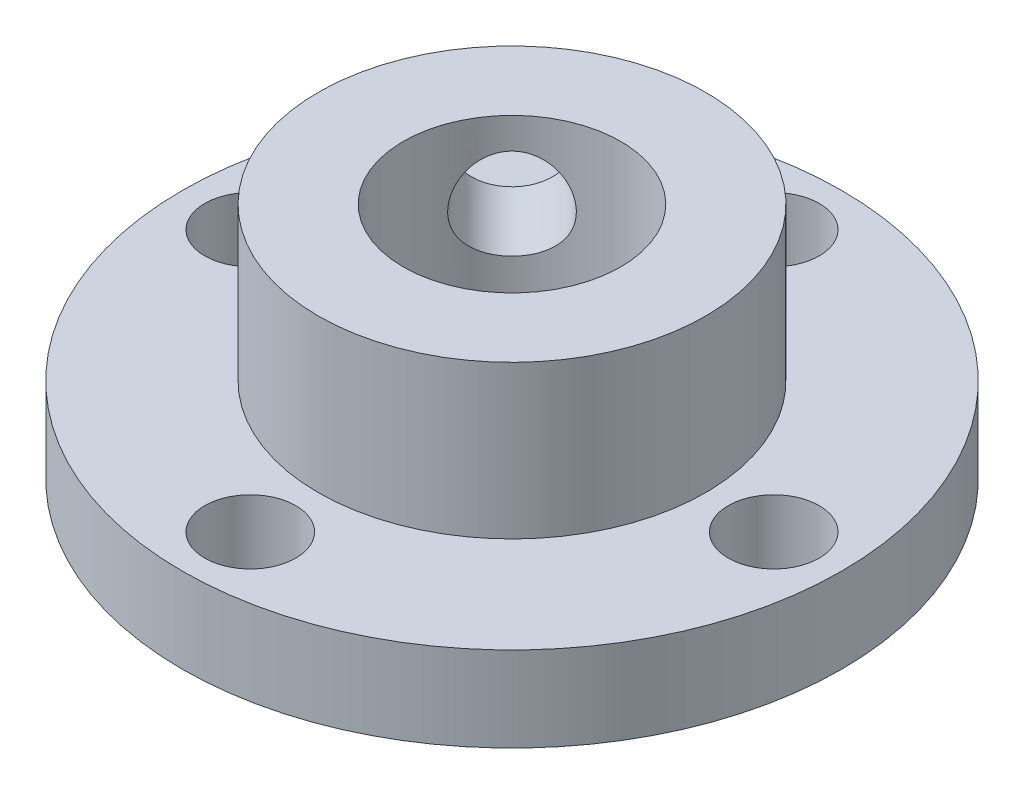
ISO-10303-21;
HEADER;
FILE_DESCRIPTION(('STEP AP214'),'2;1');
FILE_NAME('part.step','',(''),(''),'','','');
FILE_SCHEMA(('AUTOMOTIVE_DESIGN { 1 0 10303 214 1 1 1 1 }'));
ENDSEC;
DATA;
#1=APPLICATION_CONTEXT('core data for automotive mechanical design processes');
#2=APPLICATION_PROTOCOL_DEFINITION('international standard','automotive_design',2000,#1);
#3=PRODUCT_CONTEXT('',#1,'mechanical');
#4=PRODUCT('Part','Part','',(#3));
#5=PRODUCT_RELATED_PRODUCT_CATEGORY('part','',(#4));
#6=PRODUCT_DEFINITION_FORMATION('','',#4);
#7=PRODUCT_DEFINITION_CONTEXT('part definition',#1,'design');
#8=PRODUCT_DEFINITION('design','',#6,#7);
#9=PRODUCT_DEFINITION_SHAPE('','',#8);
#10=(LENGTH_UNIT() NAMED_UNIT(*) SI_UNIT(.MILLI.,.METRE.));
#11=(NAMED_UNIT(*) PLANE_ANGLE_UNIT() SI_UNIT($,.RADIAN.));
#12=(NAMED_UNIT(*) SI_UNIT($,.STERADIAN.) SOLID_ANGLE_UNIT());
#13=UNCERTAINTY_MEASURE_WITH_UNIT(LENGTH_MEASURE(1.E-05),#10,'distance_accuracy_value','');
#14=(GEOMETRIC_REPRESENTATION_CONTEXT(3) GLOBAL_UNCERTAINTY_ASSIGNED_CONTEXT((#13)) GLOBAL_UNIT_ASSIGNED_CONTEXT((#10,
#11,#12)) REPRESENTATION_CONTEXT('',''));
#15=CARTESIAN_POINT('',(0.,0.,0.));
#16=DIRECTION('',(0.,0.,1.));
#17=DIRECTION('',(1.,0.,0.));
#18=AXIS2_PLACEMENT_3D('',#15,#16,#17);
#19=CARTESIAN_POINT('',(0.,8.89,0.));
#20=DIRECTION('',(0.,-1.,0.));
#21=DIRECTION('',(0.,0.,-1.));
#22=AXIS2_PLACEMENT_3D('',#19,#20,#21);
#23=CYLINDRICAL_SURFACE('',#22,4.064);
#24=CARTESIAN_POINT('',(0.,0.,0.));
#25=DIRECTION('',(0.,1.,0.));
#26=DIRECTION('',(0.,0.,1.));
#27=AXIS2_PLACEMENT_3D('',#24,#25,#26);
#28=CIRCLE('',#27,4.064);
#29=CARTESIAN_POINT('',(0.,0.,4.064));
#30=VERTEX_POINT('',#29);
#31=EDGE_CURVE('E48',#30,#30,#28,.T.);
#32=ORIENTED_EDGE('',*,*,#31,.F.);
#33=EDGE_LOOP('',(#32));
#34=FACE_BOUND('',#33,.T.);
#35=CARTESIAN_POINT('',(0.,8.89,0.));
#36=DIRECTION('',(0.,1.,0.));
#37=DIRECTION('',(0.,0.,1.));
#38=AXIS2_PLACEMENT_3D('',#35,#36,#37);
#39=CIRCLE('',#38,4.064);
#40=CARTESIAN_POINT('',(0.,8.89,4.064));
#41=VERTEX_POINT('',#40);
#42=EDGE_CURVE('E53',#41,#41,#39,.T.);
#43=ORIENTED_EDGE('',*,*,#42,.T.);
#44=EDGE_LOOP('',(#43));
#45=FACE_BOUND('',#44,.T.);
#46=CARTESIAN_POINT('',(-3.8122631308946,6.0325,-1.40810007486034));
#47=CARTESIAN_POINT('',(-3.8122629167306,6.12313717177332,-1.40811429716405));
#48=CARTESIAN_POINT('',(-3.80950005768367,6.21392085505638,-1.41565304413687));
#49=CARTESIAN_POINT('',(-3.79834477643056,6.39286606294386,-1.44530499197514));
#50=CARTESIAN_POINT('',(-3.78993712150804,6.4810198164983,-1.46745762619727));
#51=CARTESIAN_POINT('',(-3.76726606905488,6.65179241023378,-1.52470948361983));
#52=CARTESIAN_POINT('',(-3.75302665160074,6.73443232370409,-1.5597556296708));
#53=CARTESIAN_POINT('',(-3.71831179634405,6.89266882539239,-1.64078898184562));
#54=CARTESIAN_POINT('',(-3.69783779922637,6.96826703554032,-1.68677365976005));
#55=CARTESIAN_POINT('',(-3.64882610685062,7.11506181973771,-1.79042676086083));
#56=CARTESIAN_POINT('',(-3.61989594938164,7.18576335415506,-1.84861102387344));
#57=CARTESIAN_POINT('',(-3.55400691156277,7.31619881249496,-1.97231841008837));
#58=CARTESIAN_POINT('',(-3.51704493342492,7.37592848823984,-2.03784436016493));
#59=CARTESIAN_POINT('',(-3.43293417349669,7.4852564617071,-2.17667643960391));
#60=CARTESIAN_POINT('',(-3.38541027920627,7.53429677130818,-2.25019758616494));
#61=CARTESIAN_POINT('',(-3.28132229210061,7.61706824084384,-2.39943259703352));
#62=CARTESIAN_POINT('',(-3.22476225768701,7.65080624750961,-2.4751454645324));
#63=CARTESIAN_POINT('',(-3.10663857631323,7.7002181477908,-2.62169406116741));
#64=CARTESIAN_POINT('',(-3.04549242399707,7.71674597119465,-2.69257746157351));
#65=CARTESIAN_POINT('',(-2.91736493679226,7.73402856240064,-2.83089210980763));
#66=CARTESIAN_POINT('',(-2.85038599977965,7.73478978145023,-2.89832475831866));
#67=CARTESIAN_POINT('',(-2.71700463574055,7.72096291741725,-3.02354801798928));
#68=CARTESIAN_POINT('',(-2.65081878557792,7.70731334726508,-3.08167633654323));
#69=CARTESIAN_POINT('',(-2.51734459203926,7.66666244716221,-3.19163788350568));
#70=CARTESIAN_POINT('',(-2.45005616770943,7.63966013253357,-3.24347064730685));
#71=CARTESIAN_POINT('',(-2.31557158025523,7.57275052529416,-3.34084237350517));
#72=CARTESIAN_POINT('',(-2.24839251056815,7.5326524992945,-3.38627316273941));
#73=CARTESIAN_POINT('',(-2.11740570657134,7.44087749267598,-3.46968701319376));
#74=CARTESIAN_POINT('',(-2.05359917668104,7.38919640952371,-3.50766742665028));
#75=CARTESIAN_POINT('',(-1.9271768594289,7.27145785747086,-3.57878662766352));
#76=CARTESIAN_POINT('',(-1.86496691711487,7.20464042743328,-3.61139054638039));
#77=CARTESIAN_POINT('',(-1.74946848026625,7.06066742533583,-3.66873587893796));
#78=CARTESIAN_POINT('',(-1.69618348471097,6.98350781992159,-3.69347421251488));
#79=CARTESIAN_POINT('',(-1.59957472043483,6.81779202674385,-3.73635521958136));
#80=CARTESIAN_POINT('',(-1.55664238177323,6.72894160085906,-3.75425043867228));
#81=CARTESIAN_POINT('',(-1.48594090237081,6.54432158218119,-3.7827961290087));
#82=CARTESIAN_POINT('',(-1.45816082080674,6.44855703851795,-3.79345182898312));
#83=CARTESIAN_POINT('',(-1.42118998966427,6.25949444098921,-3.80745102522936));
#84=CARTESIAN_POINT('',(-1.41090465263967,6.16644311117719,-3.81122623946043));
#85=CARTESIAN_POINT('',(-1.40630069487522,5.97990784117191,-3.8129286662771));
#86=CARTESIAN_POINT('',(-1.41197647731732,5.88642406409448,-3.81085792876354));
#87=CARTESIAN_POINT('',(-1.43794247927008,5.70805695040329,-3.80112924082953));
#88=CARTESIAN_POINT('',(-1.45726258893526,5.62300867846512,-3.79384175519348));
#89=CARTESIAN_POINT('',(-1.50818736446819,5.45734752263119,-3.77388515449684));
#90=CARTESIAN_POINT('',(-1.5397949167826,5.3767356859828,-3.76121477487411));
#91=CARTESIAN_POINT('',(-1.61513297327575,5.21840474081432,-3.729500563191));
#92=CARTESIAN_POINT('',(-1.65932173894656,5.14095430972623,-3.71020867389035));
#93=CARTESIAN_POINT('',(-1.75701988129284,4.99431095885696,-3.66495192984726));
#94=CARTESIAN_POINT('',(-1.8105333132155,4.92512165394896,-3.63898416945893));
#95=CARTESIAN_POINT('',(-1.92941528516475,4.79104650038447,-3.57746891198258));
#96=CARTESIAN_POINT('',(-1.99539665823308,4.72698151176482,-3.54130955102406));
#97=CARTESIAN_POINT('',(-2.13298839516589,4.61173118294714,-3.46017749459755));
#98=CARTESIAN_POINT('',(-2.20459919073895,4.56054683180511,-3.41520412280596));
#99=CARTESIAN_POINT('',(-2.35081975313455,4.47255202211498,-3.31625502443405));
#100=CARTESIAN_POINT('',(-2.42543752689346,4.43578318009429,-3.26225386620105));
#101=CARTESIAN_POINT('',(-2.574428633562,4.37833670447599,-3.14600037395919));
#102=CARTESIAN_POINT('',(-2.64880208645864,4.35764941022454,-3.08375302002837));
#103=CARTESIAN_POINT('',(-2.7892008068583,4.33417688098054,-2.95715376398619));
#104=CARTESIAN_POINT('',(-2.85544527385077,4.33023453491052,-2.89325804833025));
#105=CARTESIAN_POINT('',(-2.98303036020998,4.33724743553037,-2.76152632177946));
#106=CARTESIAN_POINT('',(-3.04437184923018,4.3482000340305,-2.69369101336197));
#107=CARTESIAN_POINT('',(-3.15846503268513,4.38386115741044,-2.55885200517902));
#108=CARTESIAN_POINT('',(-3.2114463138946,4.40806078732779,-2.49190613921792));
#109=CARTESIAN_POINT('',(-3.31055357519245,4.46897135953806,-2.35865067930524));
#110=CARTESIAN_POINT('',(-3.35667825601228,4.5056846687397,-2.29234120816636));
#111=CARTESIAN_POINT('',(-3.44368854522737,4.59243716641436,-2.15955816618425));
#112=CARTESIAN_POINT('',(-3.48424248835899,4.64300434183202,-2.09321303815945));
#113=CARTESIAN_POINT('',(-3.55764435986043,4.75526315951701,-1.96587720774804));
#114=CARTESIAN_POINT('',(-3.59048938958455,4.81695897091581,-1.90488852482727));
#115=CARTESIAN_POINT('',(-3.65086377834796,4.95471882652607,-1.7866163211157));
#116=CARTESIAN_POINT('',(-3.6778731734414,5.03147863873071,-1.7298748963382));
#117=CARTESIAN_POINT('',(-3.72414135111759,5.19449706085459,-1.62788701032201));
#118=CARTESIAN_POINT('',(-3.74339578200554,5.2807609695147,-1.58264700833771));
#119=CARTESIAN_POINT('',(-3.77462953250313,5.4601816193116,-1.50663758879907));
#120=CARTESIAN_POINT('',(-3.78664431114757,5.553302215788,-1.47579781064241));
#121=CARTESIAN_POINT('',(-3.80393248502223,5.74388285002318,-1.43066528420569));
#122=CARTESIAN_POINT('',(-3.8092284962367,5.84132718096525,-1.41631703933786));
#123=CARTESIAN_POINT('',(-3.81193720468888,5.97023974992129,-1.40897841784436));
#124=CARTESIAN_POINT('',(-3.81226320447152,6.00136122862675,-1.40809518872969));
#125=CARTESIAN_POINT('',(-3.8122631308946,6.0325,-1.40810007486034));
#126=B_SPLINE_CURVE_WITH_KNOTS('',3,(#46,#47,#48,#49,#50,#51,#52,#53,#54,#55,#56,#57,#58,#59,
#60,#61,#62,#63,#64,#65,#66,#67,#68,#69,#70,#71,#72,#73,#74,#75,#76,#77,#78,#79,#80,#81,#82,#83,
#84,#85,#86,#87,#88,#89,#90,#91,#92,#93,#94,#95,#96,#97,#98,#99,#100,#101,#102,#103,#104,#105,
#106,#107,#108,#109,#110,#111,#112,#113,#114,#115,#116,#117,#118,#119,#120,#121,#122,#123,#124,
#125),.UNSPECIFIED.,.T.,.F.,(4,2,2,2,2,2,2,2,2,2,2,2,2,2,2,2,2,2,2,2,2,2,2,2,2,2,2,2,2,2,2,2,2,
2,2,2,2,2,2,4),(0.,0.271821744428133,0.544379975260841,0.815828529155612,1.08721440433628,
1.37403856742104,1.66097355251523,1.96046967734295,2.25983166567999,2.54350694707626,
2.82706615429679,3.09323461109711,3.35942269901519,3.62967483084266,3.90002283333877,
4.18955640707095,4.47920322659882,4.77850887544751,5.07759812089829,5.35717361254571,
5.63665108237035,5.8980318585001,6.15947407280168,6.43203110499459,6.70470696796916,
6.99979008794838,7.2948958593484,7.59084741445685,7.88662104516628,8.16158532072778,
8.43650071645693,8.70152885389382,8.96660714810884,9.24368457336116,9.52086601679842,
9.8170830285848,10.1134660316016,10.4083853266649,10.7023092393918,10.7956947123542),.UNSPECIFIED.);
#127=CARTESIAN_POINT('',(-3.8122631308946,6.0325,-1.40810007486034));
#128=VERTEX_POINT('',#127);
#129=EDGE_CURVE('E113',#128,#128,#126,.T.);
#130=ORIENTED_EDGE('',*,*,#129,.T.);
#131=EDGE_LOOP('',(#130));
#132=FACE_BOUND('',#131,.T.);
#133=ADVANCED_FACE('F45',(#34,#45,#132),#23,.F.);
#134=CARTESIAN_POINT('',(0.,8.89,0.));
#135=DIRECTION('',(0.,-1.,0.));
#136=DIRECTION('',(0.,0.,-1.));
#137=AXIS2_PLACEMENT_3D('',#134,#135,#136);
#138=CYLINDRICAL_SURFACE('',#137,7.239);
#139=CARTESIAN_POINT('',(0.,3.175,0.));
#140=DIRECTION('',(0.,1.,0.));
#141=DIRECTION('',(0.,0.,1.));
#142=AXIS2_PLACEMENT_3D('',#139,#140,#141);
#143=CIRCLE('',#142,7.239);
#144=CARTESIAN_POINT('',(0.,3.175,7.239));
#145=VERTEX_POINT('',#144);
#146=EDGE_CURVE('E64',#145,#145,#143,.T.);
#147=ORIENTED_EDGE('',*,*,#146,.T.);
#148=EDGE_LOOP('',(#147));
#149=FACE_BOUND('',#148,.T.);
#150=CARTESIAN_POINT('',(0.,8.89,0.));
#151=DIRECTION('',(0.,1.,0.));
#152=DIRECTION('',(0.,0.,1.));
#153=AXIS2_PLACEMENT_3D('',#150,#151,#152);
#154=CIRCLE('',#153,7.239);
#155=CARTESIAN_POINT('',(0.,8.89,7.239));
#156=VERTEX_POINT('',#155);
#157=EDGE_CURVE('E10',#156,#156,#154,.T.);
#158=ORIENTED_EDGE('',*,*,#157,.F.);
#159=EDGE_LOOP('',(#158));
#160=FACE_BOUND('',#159,.T.);
#161=CARTESIAN_POINT('',(-3.77351496888653,6.0325,-6.17767802492079));
#162=CARTESIAN_POINT('',(-3.77351839738558,6.12656605329169,-6.17767724884184));
#163=CARTESIAN_POINT('',(-3.78040277063672,6.22066637053902,-6.17348686419495));
#164=CARTESIAN_POINT('',(-3.80760688677222,6.40617789192367,-6.15674401065578));
#165=CARTESIAN_POINT('',(-3.82793539070546,6.49758730189514,-6.14418608890509));
#166=CARTESIAN_POINT('',(-3.88101007567513,6.67500684921656,-6.11079835883516));
#167=CARTESIAN_POINT('',(-3.91374143563871,6.76102328859479,-6.0899784219999));
#168=CARTESIAN_POINT('',(-3.99015114784148,6.92548827101533,-6.04018917906428));
#169=CARTESIAN_POINT('',(-4.03382962377458,7.00393672853145,-6.01121978088088));
#170=CARTESIAN_POINT('',(-4.13118726372193,7.15256443180234,-5.94474040434438));
#171=CARTESIAN_POINT('',(-4.18502804134846,7.22257496997849,-5.9070898571692));
#172=CARTESIAN_POINT('',(-4.30008210280018,7.35085758398063,-5.82386874998704));
#173=CARTESIAN_POINT('',(-4.36129601509532,7.40912865802725,-5.77829751469098));
#174=CARTESIAN_POINT('',(-4.48962361025973,7.51295707596413,-5.67917631246267));
#175=CARTESIAN_POINT('',(-4.55680023128788,7.55835040810837,-5.62553567554793));
#176=CARTESIAN_POINT('',(-4.69395479805918,7.63407105866445,-5.5116100715486));
#177=CARTESIAN_POINT('',(-4.76393237908856,7.66440033171998,-5.451325967731));
#178=CARTESIAN_POINT('',(-4.9029774427052,7.70859641147198,-5.32658391669184));
#179=CARTESIAN_POINT('',(-4.97203868280289,7.72274925219571,-5.2622204393869));
#180=CARTESIAN_POINT('',(-5.1082783820092,7.73508679424676,-5.1300695813074));
#181=CARTESIAN_POINT('',(-5.17545708681962,7.73327358923491,-5.06228265061648));
#182=CARTESIAN_POINT('',(-5.30468515887714,7.71393989594568,-4.92666652753175));
#183=CARTESIAN_POINT('',(-5.3668092474294,7.69672792690579,-4.85886419763858));
#184=CARTESIAN_POINT('',(-5.48585784874769,7.64757905378632,-4.7240425065449));
#185=CARTESIAN_POINT('',(-5.54278210409765,7.61564142119031,-4.65702318425));
#186=CARTESIAN_POINT('',(-5.65074946998817,7.53768665432177,-4.52542395714121));
#187=CARTESIAN_POINT('',(-5.70174050379301,7.49155616835788,-4.46086857426844));
#188=CARTESIAN_POINT('',(-5.79652567127759,7.38661038703142,-4.33699247099632));
#189=CARTESIAN_POINT('',(-5.84031868497172,7.32779312093822,-4.27767256588179));
#190=CARTESIAN_POINT('',(-5.92117442339494,7.19747633470609,-4.16506199842691));
#191=CARTESIAN_POINT('',(-5.95805095303843,7.12570694097088,-4.11194964682553));
#192=CARTESIAN_POINT('',(-6.02342885982087,6.97239594564368,-4.01557306911523));
#193=CARTESIAN_POINT('',(-6.05192993395332,6.89085399065102,-3.9723091993166));
#194=CARTESIAN_POINT('',(-6.10046021860131,6.71985178632373,-3.89737298512928));
#195=CARTESIAN_POINT('',(-6.12045642038564,6.63036228571355,-3.86574586768157));
#196=CARTESIAN_POINT('',(-6.15169022457492,6.44627870840447,-3.81584906740815));
#197=CARTESIAN_POINT('',(-6.1629294546282,6.35168558380685,-3.79757690235181));
#198=CARTESIAN_POINT('',(-6.17642460333276,6.16245265808086,-3.77558792165684));
#199=CARTESIAN_POINT('',(-6.17888465028768,6.06786578320057,-3.77154039774324));
#200=CARTESIAN_POINT('',(-6.17537550343106,5.87927620260822,-3.77728335774721));
#201=CARTESIAN_POINT('',(-6.16940698546764,5.78527345066506,-3.78707273214717));
#202=CARTESIAN_POINT('',(-6.14922218107307,5.60188063733081,-3.81975707633639));
#203=CARTESIAN_POINT('',(-6.13512287050385,5.51244434358044,-3.84246611280581));
#204=CARTESIAN_POINT('',(-6.09884787675746,5.33920290923257,-3.89978444917866));
#205=CARTESIAN_POINT('',(-6.07667132617393,5.25539837456913,-3.93439502715388));
#206=CARTESIAN_POINT('',(-6.02390912272195,5.09417980473237,-4.01472047057622));
#207=CARTESIAN_POINT('',(-5.99318286953128,5.0169035526651,-4.06061936302961));
#208=CARTESIAN_POINT('',(-5.92370757542675,4.87240113239183,-4.16131508835515));
#209=CARTESIAN_POINT('',(-5.88495737782132,4.80517641557343,-4.21611320384868));
#210=CARTESIAN_POINT('',(-5.79885062980333,4.68118552640242,-4.33380588692611));
#211=CARTESIAN_POINT('',(-5.75132497580087,4.62467910608163,-4.39685083300481));
#212=CARTESIAN_POINT('',(-5.64888046804314,4.52560070292739,-4.52771077199158));
#213=CARTESIAN_POINT('',(-5.59396198400344,4.48302802363238,-4.59552552628053));
#214=CARTESIAN_POINT('',(-5.47811590216484,4.41337125104158,-4.73301003832796));
#215=CARTESIAN_POINT('',(-5.41723276805416,4.386181463642,-4.80266360850533));
#216=CARTESIAN_POINT('',(-5.29053730179873,4.34773791814252,-4.9418807182002));
#217=CARTESIAN_POINT('',(-5.22472580437731,4.33648146779115,-5.01144427094283));
#218=CARTESIAN_POINT('',(-5.09160299334761,4.33036049029992,-5.14659930179632));
#219=CARTESIAN_POINT('',(-5.02436516452666,4.33511046563849,-5.21224598363029));
#220=CARTESIAN_POINT('',(-4.88892281569039,4.35999489797305,-5.3394934664105));
#221=CARTESIAN_POINT('',(-4.82071831851273,4.38012899210999,-5.40109436274585));
#222=CARTESIAN_POINT('',(-4.6858116674998,4.43501394544916,-5.51853803506637));
#223=CARTESIAN_POINT('',(-4.61910437482703,4.46970254671615,-5.57440409003298));
#224=CARTESIAN_POINT('',(-4.48908850857767,4.55265377451004,-5.67963102643628));
#225=CARTESIAN_POINT('',(-4.42578031759899,4.60091792528241,-5.72899117648374));
#226=CARTESIAN_POINT('',(-4.30341920114489,4.7108666236151,-5.82148771977298));
#227=CARTESIAN_POINT('',(-4.24448715573915,4.77281760710374,-5.86446733283267));
#228=CARTESIAN_POINT('',(-4.13460759654003,4.90785392522441,-5.94244823126259));
#229=CARTESIAN_POINT('',(-4.08366205507624,4.98094200148805,-5.97744754680278));
#230=CARTESIAN_POINT('',(-3.99106815392999,5.13758004042403,-6.03967428416686));
#231=CARTESIAN_POINT('',(-3.94958093416272,5.22127819390106,-6.06676893054593));
#232=CARTESIAN_POINT('',(-3.8788558894594,5.39586253000664,-6.11223188781296));
#233=CARTESIAN_POINT('',(-3.84960841275775,5.4867429814741,-6.13060707604936));
#234=CARTESIAN_POINT('',(-3.8094850310534,5.65341406693763,-6.15559683159429));
#235=CARTESIAN_POINT('',(-3.79603692527851,5.72835054155385,-6.1638734301749));
#236=CARTESIAN_POINT('',(-3.77805079197943,5.87968386978339,-6.17491416239144));
#237=CARTESIAN_POINT('',(-3.77351218356988,5.95608062786056,-6.17767865540825));
#238=CARTESIAN_POINT('',(-3.77351496888653,6.0325,-6.17767802492079));
#239=B_SPLINE_CURVE_WITH_KNOTS('',3,(#161,#162,#163,#164,#165,#166,#167,#168,#169,#170,#171,
#172,#173,#174,#175,#176,#177,#178,#179,#180,#181,#182,#183,#184,#185,#186,#187,#188,#189,#190,
#191,#192,#193,#194,#195,#196,#197,#198,#199,#200,#201,#202,#203,#204,#205,#206,#207,#208,#209,
#210,#211,#212,#213,#214,#215,#216,#217,#218,#219,#220,#221,#222,#223,#224,#225,#226,#227,#228,
#229,#230,#231,#232,#233,#234,#235,#236,#237,#238),.UNSPECIFIED.,.T.,.F.,(4,2,2,2,2,2,2,2,2,2,2,
2,2,2,2,2,2,2,2,2,2,2,2,2,2,2,2,2,2,2,2,2,2,2,2,2,2,2,4),(0.,0.281917817271218,
0.564019531351605,0.845785199293901,1.12755405111321,1.41425312961271,1.70097666303421,
1.99120291229897,2.28139149328326,2.56636543335985,2.85130200476663,3.13065454308231,
3.41002090316941,3.69167904146921,3.97338096334317,4.26182597260046,4.55028141591216,
4.83984640369691,5.12935755752079,5.41209165241741,5.69480307744582,5.97354521159795,
6.25231728840652,6.53597637243459,6.81967637583574,7.10955696851576,7.39942306964383,
7.68727256214416,7.97507341098872,8.25599290856513,8.53690578041034,8.81662908453945,
9.09638380819164,9.38215837552177,9.66800340631386,9.95840476530779,10.2485766920725,
10.4776219917234,10.7066523574812),.UNSPECIFIED.);
#240=CARTESIAN_POINT('',(-3.77351496888653,6.0325,-6.17767802492079));
#241=VERTEX_POINT('',#240);
#242=EDGE_CURVE('E78',#241,#241,#239,.T.);
#243=ORIENTED_EDGE('',*,*,#242,.T.);
#244=EDGE_LOOP('',(#243));
#245=FACE_BOUND('',#244,.T.);
#246=ADVANCED_FACE('F155',(#149,#160,#245),#138,.T.);
#247=CARTESIAN_POINT('',(0.,8.89,0.));
#248=DIRECTION('',(0.,1.,0.));
#249=DIRECTION('',(0.,0.,1.));
#250=AXIS2_PLACEMENT_3D('',#247,#248,#249);
#251=PLANE('',#250);
#252=ORIENTED_EDGE('',*,*,#42,.F.);
#253=EDGE_LOOP('',(#252));
#254=FACE_BOUND('',#253,.T.);
#255=ORIENTED_EDGE('',*,*,#157,.T.);
#256=EDGE_LOOP('',(#255));
#257=FACE_BOUND('',#256,.T.);
#258=ADVANCED_FACE('F152',(#254,#257),#251,.T.);
#259=CARTESIAN_POINT('',(0.,0.,0.));
#260=DIRECTION('',(0.,1.,0.));
#261=DIRECTION('',(0.,0.,1.));
#262=AXIS2_PLACEMENT_3D('',#259,#260,#261);
#263=PLANE('',#262);
#264=CARTESIAN_POINT('',(0.,0.,-9.779));
#265=DIRECTION('',(0.,1.,0.));
#266=DIRECTION('',(0.,0.,1.));
#267=AXIS2_PLACEMENT_3D('',#264,#265,#266);
#268=CIRCLE('',#267,1.7);
#269=CARTESIAN_POINT('',(0.,0.,-8.079));
#270=VERTEX_POINT('',#269);
#271=EDGE_CURVE('E65',#270,#270,#268,.T.);
#272=ORIENTED_EDGE('',*,*,#271,.T.);
#273=EDGE_LOOP('',(#272));
#274=FACE_BOUND('',#273,.T.);
#275=CARTESIAN_POINT('',(9.779,0.,0.));
#276=DIRECTION('',(0.,1.,0.));
#277=DIRECTION('',(0.,0.,1.));
#278=AXIS2_PLACEMENT_3D('',#275,#276,#277);
#279=CIRCLE('',#278,1.7);
#280=CARTESIAN_POINT('',(9.779,0.,1.7));
#281=VERTEX_POINT('',#280);
#282=EDGE_CURVE('E90',#281,#281,#279,.T.);
#283=ORIENTED_EDGE('',*,*,#282,.T.);
#284=EDGE_LOOP('',(#283));
#285=FACE_BOUND('',#284,.T.);
#286=CARTESIAN_POINT('',(0.,0.,9.779));
#287=DIRECTION('',(0.,1.,0.));
#288=DIRECTION('',(0.,0.,1.));
#289=AXIS2_PLACEMENT_3D('',#286,#287,#288);
#290=CIRCLE('',#289,1.7);
#291=CARTESIAN_POINT('',(0.,0.,11.479));
#292=VERTEX_POINT('',#291);
#293=EDGE_CURVE('E82',#292,#292,#290,.T.);
#294=ORIENTED_EDGE('',*,*,#293,.T.);
#295=EDGE_LOOP('',(#294));
#296=FACE_BOUND('',#295,.T.);
#297=CARTESIAN_POINT('',(-9.779,0.,0.));
#298=DIRECTION('',(0.,1.,0.));
#299=DIRECTION('',(0.,0.,1.));
#300=AXIS2_PLACEMENT_3D('',#297,#298,#299);
#301=CIRCLE('',#300,1.7);
#302=CARTESIAN_POINT('',(-9.779,0.,1.7));
#303=VERTEX_POINT('',#302);
#304=EDGE_CURVE('E73',#303,#303,#301,.T.);
#305=ORIENTED_EDGE('',*,*,#304,.T.);
#306=EDGE_LOOP('',(#305));
#307=FACE_BOUND('',#306,.T.);
#308=ORIENTED_EDGE('',*,*,#31,.T.);
#309=EDGE_LOOP('',(#308));
#310=FACE_BOUND('',#309,.T.);
#311=CARTESIAN_POINT('',(0.,0.,0.));
#312=DIRECTION('',(0.,1.,0.));
#313=DIRECTION('',(0.,0.,1.));
#314=AXIS2_PLACEMENT_3D('',#311,#312,#313);
#315=CIRCLE('',#314,12.319);
#316=CARTESIAN_POINT('',(0.,0.,12.319));
#317=VERTEX_POINT('',#316);
#318=EDGE_CURVE('E60',#317,#317,#315,.T.);
#319=ORIENTED_EDGE('',*,*,#318,.F.);
#320=EDGE_LOOP('',(#319));
#321=FACE_BOUND('',#320,.T.);
#322=ADVANCED_FACE('F150',(#274,#285,#296,#307,#310,#321),#263,.F.);
#323=CARTESIAN_POINT('',(0.,3.175,0.));
#324=DIRECTION('',(0.,-1.,0.));
#325=DIRECTION('',(0.,0.,-1.));
#326=AXIS2_PLACEMENT_3D('',#323,#324,#325);
#327=CYLINDRICAL_SURFACE('',#326,12.319);
#328=CARTESIAN_POINT('',(0.,3.175,0.));
#329=DIRECTION('',(0.,1.,0.));
#330=DIRECTION('',(0.,0.,1.));
#331=AXIS2_PLACEMENT_3D('',#328,#329,#330);
#332=CIRCLE('',#331,12.319);
#333=CARTESIAN_POINT('',(0.,3.175,12.319));
#334=VERTEX_POINT('',#333);
#335=EDGE_CURVE('E66',#334,#334,#332,.T.);
#336=ORIENTED_EDGE('',*,*,#335,.F.);
#337=EDGE_LOOP('',(#336));
#338=FACE_BOUND('',#337,.T.);
#339=ORIENTED_EDGE('',*,*,#318,.T.);
#340=EDGE_LOOP('',(#339));
#341=FACE_BOUND('',#340,.T.);
#342=ADVANCED_FACE('F146',(#338,#341),#327,.T.);
#343=CARTESIAN_POINT('',(0.,3.175,0.));
#344=DIRECTION('',(0.,1.,0.));
#345=DIRECTION('',(0.,0.,1.));
#346=AXIS2_PLACEMENT_3D('',#343,#344,#345);
#347=PLANE('',#346);
#348=CARTESIAN_POINT('',(0.,3.175,-9.779));
#349=DIRECTION('',(0.,1.,0.));
#350=DIRECTION('',(0.,0.,1.));
#351=AXIS2_PLACEMENT_3D('',#348,#349,#350);
#352=CIRCLE('',#351,1.7);
#353=CARTESIAN_POINT('',(0.,3.175,-8.079));
#354=VERTEX_POINT('',#353);
#355=EDGE_CURVE('E98',#354,#354,#352,.T.);
#356=ORIENTED_EDGE('',*,*,#355,.F.);
#357=EDGE_LOOP('',(#356));
#358=FACE_BOUND('',#357,.T.);
#359=CARTESIAN_POINT('',(9.779,3.175,0.));
#360=DIRECTION('',(0.,1.,0.));
#361=DIRECTION('',(0.,0.,1.));
#362=AXIS2_PLACEMENT_3D('',#359,#360,#361);
#363=CIRCLE('',#362,1.7);
#364=CARTESIAN_POINT('',(9.779,3.175,1.7));
#365=VERTEX_POINT('',#364);
#366=EDGE_CURVE('E94',#365,#365,#363,.T.);
#367=ORIENTED_EDGE('',*,*,#366,.F.);
#368=EDGE_LOOP('',(#367));
#369=FACE_BOUND('',#368,.T.);
#370=CARTESIAN_POINT('',(0.,3.175,9.779));
#371=DIRECTION('',(0.,1.,0.));
#372=DIRECTION('',(0.,0.,1.));
#373=AXIS2_PLACEMENT_3D('',#370,#371,#372);
#374=CIRCLE('',#373,1.7);
#375=CARTESIAN_POINT('',(0.,3.175,11.479));
#376=VERTEX_POINT('',#375);
#377=EDGE_CURVE('E86',#376,#376,#374,.T.);
#378=ORIENTED_EDGE('',*,*,#377,.F.);
#379=EDGE_LOOP('',(#378));
#380=FACE_BOUND('',#379,.T.);
#381=CARTESIAN_POINT('',(-9.779,3.175,0.));
#382=DIRECTION('',(0.,1.,0.));
#383=DIRECTION('',(0.,0.,1.));
#384=AXIS2_PLACEMENT_3D('',#381,#382,#383);
#385=CIRCLE('',#384,1.7);
#386=CARTESIAN_POINT('',(-9.779,3.175,1.7));
#387=VERTEX_POINT('',#386);
#388=EDGE_CURVE('E77',#387,#387,#385,.T.);
#389=ORIENTED_EDGE('',*,*,#388,.F.);
#390=EDGE_LOOP('',(#389));
#391=FACE_BOUND('',#390,.T.);
#392=ORIENTED_EDGE('',*,*,#146,.F.);
#393=EDGE_LOOP('',(#392));
#394=FACE_BOUND('',#393,.T.);
#395=ORIENTED_EDGE('',*,*,#335,.T.);
#396=EDGE_LOOP('',(#395));
#397=FACE_BOUND('',#396,.T.);
#398=ADVANCED_FACE('F142',(#358,#369,#380,#391,#394,#397),#347,.T.);
#399=CARTESIAN_POINT('',(-9.779,0.,0.));
#400=DIRECTION('',(0.,1.,0.));
#401=DIRECTION('',(0.,0.,1.));
#402=AXIS2_PLACEMENT_3D('',#399,#400,#401);
#403=CYLINDRICAL_SURFACE('',#402,1.7);
#404=ORIENTED_EDGE('',*,*,#304,.F.);
#405=EDGE_LOOP('',(#404));
#406=FACE_BOUND('',#405,.T.);
#407=ORIENTED_EDGE('',*,*,#388,.T.);
#408=EDGE_LOOP('',(#407));
#409=FACE_BOUND('',#408,.T.);
#410=ADVANCED_FACE('F138',(#406,#409),#403,.F.);
#411=CARTESIAN_POINT('',(0.,0.,9.779));
#412=DIRECTION('',(0.,1.,0.));
#413=DIRECTION('',(0.,0.,1.));
#414=AXIS2_PLACEMENT_3D('',#411,#412,#413);
#415=CYLINDRICAL_SURFACE('',#414,1.7);
#416=ORIENTED_EDGE('',*,*,#293,.F.);
#417=EDGE_LOOP('',(#416));
#418=FACE_BOUND('',#417,.T.);
#419=ORIENTED_EDGE('',*,*,#377,.T.);
#420=EDGE_LOOP('',(#419));
#421=FACE_BOUND('',#420,.T.);
#422=ADVANCED_FACE('F134',(#418,#421),#415,.F.);
#423=CARTESIAN_POINT('',(9.779,0.,0.));
#424=DIRECTION('',(0.,1.,0.));
#425=DIRECTION('',(0.,0.,1.));
#426=AXIS2_PLACEMENT_3D('',#423,#424,#425);
#427=CYLINDRICAL_SURFACE('',#426,1.7);
#428=ORIENTED_EDGE('',*,*,#282,.F.);
#429=EDGE_LOOP('',(#428));
#430=FACE_BOUND('',#429,.T.);
#431=ORIENTED_EDGE('',*,*,#366,.T.);
#432=EDGE_LOOP('',(#431));
#433=FACE_BOUND('',#432,.T.);
#434=ADVANCED_FACE('F130',(#430,#433),#427,.F.);
#435=CARTESIAN_POINT('',(0.,0.,-9.779));
#436=DIRECTION('',(0.,1.,0.));
#437=DIRECTION('',(0.,0.,1.));
#438=AXIS2_PLACEMENT_3D('',#435,#436,#437);
#439=CYLINDRICAL_SURFACE('',#438,1.7);
#440=ORIENTED_EDGE('',*,*,#271,.F.);
#441=EDGE_LOOP('',(#440));
#442=FACE_BOUND('',#441,.T.);
#443=ORIENTED_EDGE('',*,*,#355,.T.);
#444=EDGE_LOOP('',(#443));
#445=FACE_BOUND('',#444,.T.);
#446=ADVANCED_FACE('F126',(#442,#445),#439,.F.);
#447=CARTESIAN_POINT('',(-12.32,6.0325,-12.32));
#448=DIRECTION('',(0.707106781186548,0.,0.707106781186548));
#449=DIRECTION('',(0.707106781186547,0.,-0.707106781186548));
#450=AXIS2_PLACEMENT_3D('',#447,#448,#449);
#451=CYLINDRICAL_SURFACE('',#450,1.7);
#452=ORIENTED_EDGE('',*,*,#242,.F.);
#453=EDGE_LOOP('',(#452));
#454=FACE_BOUND('',#453,.T.);
#455=ORIENTED_EDGE('',*,*,#129,.F.);
#456=EDGE_LOOP('',(#455));
#457=FACE_BOUND('',#456,.T.);
#458=ADVANCED_FACE('F119',(#454,#457),#451,.F.);
#459=CLOSED_SHELL('',(#133,#246,#258,#322,#342,#398,#410,#422,#434,#446,#458));
#460=MANIFOLD_SOLID_BREP('B2',#459);
#461=ADVANCED_BREP_SHAPE_REPRESENTATION('',(#18,#460),#14);
#462=SHAPE_DEFINITION_REPRESENTATION(#9,#461);
ENDSEC;
END-ISO-10303-21;
